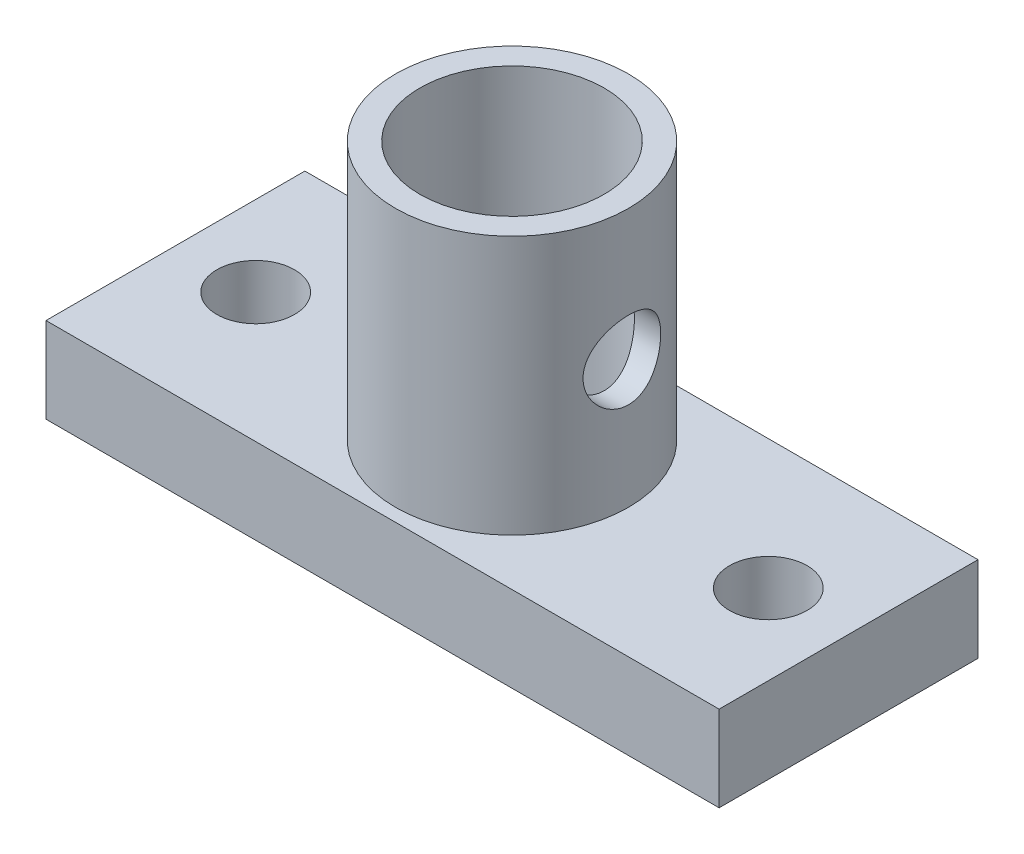
ISO-10303-21;
HEADER;
FILE_DESCRIPTION(('STEP AP214'),'2;1');
FILE_NAME('part.step','',(''),(''),'','','');
FILE_SCHEMA(('AUTOMOTIVE_DESIGN { 1 0 10303 214 1 1 1 1 }'));
ENDSEC;
DATA;
#1=APPLICATION_CONTEXT('core data for automotive mechanical design processes');
#2=APPLICATION_PROTOCOL_DEFINITION('international standard','automotive_design',2000,#1);
#3=PRODUCT_CONTEXT('',#1,'mechanical');
#4=PRODUCT('Part','Part','',(#3));
#5=PRODUCT_RELATED_PRODUCT_CATEGORY('part','',(#4));
#6=PRODUCT_DEFINITION_FORMATION('','',#4);
#7=PRODUCT_DEFINITION_CONTEXT('part definition',#1,'design');
#8=PRODUCT_DEFINITION('design','',#6,#7);
#9=PRODUCT_DEFINITION_SHAPE('','',#8);
#10=(LENGTH_UNIT() NAMED_UNIT(*) SI_UNIT(.MILLI.,.METRE.));
#11=(NAMED_UNIT(*) PLANE_ANGLE_UNIT() SI_UNIT($,.RADIAN.));
#12=(NAMED_UNIT(*) SI_UNIT($,.STERADIAN.) SOLID_ANGLE_UNIT());
#13=UNCERTAINTY_MEASURE_WITH_UNIT(LENGTH_MEASURE(1.E-05),#10,'distance_accuracy_value','');
#14=(GEOMETRIC_REPRESENTATION_CONTEXT(3) GLOBAL_UNCERTAINTY_ASSIGNED_CONTEXT((#13)) GLOBAL_UNIT_ASSIGNED_CONTEXT((#10,
#11,#12)) REPRESENTATION_CONTEXT('',''));
#15=CARTESIAN_POINT('',(0.,0.,0.));
#16=DIRECTION('',(0.,0.,1.));
#17=DIRECTION('',(1.,0.,0.));
#18=AXIS2_PLACEMENT_3D('',#15,#16,#17);
#19=CARTESIAN_POINT('',(0.,13.302,0.));
#20=DIRECTION('',(0.,-1.,0.));
#21=DIRECTION('',(0.,0.,-1.));
#22=AXIS2_PLACEMENT_3D('',#19,#20,#21);
#23=CYLINDRICAL_SURFACE('',#22,4.5);
#24=CARTESIAN_POINT('',(0.,13.302,0.));
#25=DIRECTION('',(0.,1.,0.));
#26=DIRECTION('',(0.,0.,1.));
#27=AXIS2_PLACEMENT_3D('',#24,#25,#26);
#28=CIRCLE('',#27,4.5);
#29=CARTESIAN_POINT('',(0.,13.302,4.5));
#30=VERTEX_POINT('',#29);
#31=EDGE_CURVE('E204',#30,#30,#28,.T.);
#32=ORIENTED_EDGE('',*,*,#31,.F.);
#33=EDGE_LOOP('',(#32));
#34=FACE_BOUND('',#33,.T.);
#35=CARTESIAN_POINT('',(0.,3.302,0.));
#36=DIRECTION('',(0.,-1.,0.));
#37=DIRECTION('',(0.,0.,-1.));
#38=AXIS2_PLACEMENT_3D('',#35,#36,#37);
#39=CIRCLE('',#38,4.5);
#40=CARTESIAN_POINT('',(0.,3.302,-4.5));
#41=VERTEX_POINT('',#40);
#42=EDGE_CURVE('E12',#41,#41,#39,.F.);
#43=ORIENTED_EDGE('',*,*,#42,.T.);
#44=EDGE_LOOP('',(#43));
#45=FACE_BOUND('',#44,.T.);
#46=CARTESIAN_POINT('',(4.24264068711928,8.23272632288013,1.5));
#47=CARTESIAN_POINT('',(4.24264041795651,8.15102406062602,1.50000038692157));
#48=CARTESIAN_POINT('',(4.24502653936286,8.06932412314475,1.49330217552828));
#49=CARTESIAN_POINT('',(4.25426361121882,7.90834469138876,1.46677669753321));
#50=CARTESIAN_POINT('',(4.26111529713283,7.82906559807143,1.4469472682526));
#51=CARTESIAN_POINT('',(4.27842305533187,7.6752859833842,1.39493322852736));
#52=CARTESIAN_POINT('',(4.28887205956983,7.60077642871606,1.36277283210487));
#53=CARTESIAN_POINT('',(4.31218683015487,7.45818625005819,1.28709244266207));
#54=CARTESIAN_POINT('',(4.32505312955418,7.39010704904969,1.24356994329027));
#55=CARTESIAN_POINT('',(4.3523173411121,7.25964637937266,1.14457671966432));
#56=CARTESIAN_POINT('',(4.36675342266966,7.19755317987254,1.08873651206688));
#57=CARTESIAN_POINT('',(4.39520797201504,7.08341612104318,0.967481500821593));
#58=CARTESIAN_POINT('',(4.40922637243442,7.03137387550658,0.902065162578564));
#59=CARTESIAN_POINT('',(4.43570800382698,6.93750797688574,0.761406761947515));
#60=CARTESIAN_POINT('',(4.44812111552408,6.8959863669532,0.685952866836788));
#61=CARTESIAN_POINT('',(4.46954380156474,6.82633894518887,0.528646834481211));
#62=CARTESIAN_POINT('',(4.47855429304502,6.79820952311477,0.446796428530819));
#63=CARTESIAN_POINT('',(4.49188613147861,6.75712254093154,0.282043226150242));
#64=CARTESIAN_POINT('',(4.49635972166341,6.74367115349463,0.199276132279452));
#65=CARTESIAN_POINT('',(4.5006541232737,6.73075188283914,0.032546812236136));
#66=CARTESIAN_POINT('',(4.50047613394335,6.73128039540151,-0.0514151003158394));
#67=CARTESIAN_POINT('',(4.49559059428104,6.74599270472918,-0.214655272790726));
#68=CARTESIAN_POINT('',(4.49106097132703,6.75964011559189,-0.2939880728875));
#69=CARTESIAN_POINT('',(4.47820451009571,6.79931579435081,-0.449165158233241));
#70=CARTESIAN_POINT('',(4.46987741446672,6.82534490134977,-0.525009206668763));
#71=CARTESIAN_POINT('',(4.45013505439938,6.88935829883933,-0.67222871226302));
#72=CARTESIAN_POINT('',(4.43868063786404,6.9274952307003,-0.743532331453497));
#73=CARTESIAN_POINT('',(4.41387589557997,7.01451588105272,-0.878886488290753));
#74=CARTESIAN_POINT('',(4.40052504300777,7.06340258787009,-0.942935001577153));
#75=CARTESIAN_POINT('',(4.37259287776335,7.17323791307124,-1.06515129982786));
#76=CARTESIAN_POINT('',(4.35798322759,7.2346460596483,-1.12290023560133));
#77=CARTESIAN_POINT('',(4.32971002867667,7.36639941146412,-1.22741588939383));
#78=CARTESIAN_POINT('',(4.31604662597175,7.43674599144999,-1.27418091490951));
#79=CARTESIAN_POINT('',(4.29105787703296,7.58570676130326,-1.3559811825641));
#80=CARTESIAN_POINT('',(4.27976864008232,7.66442451993185,-1.39083969547657));
#81=CARTESIAN_POINT('',(4.26122476317448,7.82708341427953,-1.44666478994926));
#82=CARTESIAN_POINT('',(4.25396843251835,7.91102234471287,-1.46763719363329));
#83=CARTESIAN_POINT('',(4.24469454453105,8.07768385598106,-1.49424192313571));
#84=CARTESIAN_POINT('',(4.24245540472709,8.16029045999872,-1.50052364325862));
#85=CARTESIAN_POINT('',(4.24285008094201,8.32539054655569,-1.49940815836741));
#86=CARTESIAN_POINT('',(4.24548301189152,8.40788404691727,-1.49201343784089));
#87=CARTESIAN_POINT('',(4.25510427134068,8.56746177144688,-1.46433847732775));
#88=CARTESIAN_POINT('',(4.2619398816089,8.64463446810609,-1.44450959097083));
#89=CARTESIAN_POINT('',(4.27902830506905,8.79454173223921,-1.39307079384089));
#90=CARTESIAN_POINT('',(4.2892817240236,8.86727551026638,-1.36145879454519));
#91=CARTESIAN_POINT('',(4.31245316393576,9.00879695415055,-1.28621151110835));
#92=CARTESIAN_POINT('',(4.32544538498415,9.07738628684281,-1.24222667753773));
#93=CARTESIAN_POINT('',(4.35248653096476,9.20644540145573,-1.14387844583635));
#94=CARTESIAN_POINT('',(4.36653576665699,9.26691278087197,-1.08951198824818));
#95=CARTESIAN_POINT('',(4.39492557956765,9.38101829901608,-0.968837558850485));
#96=CARTESIAN_POINT('',(4.40924765366843,9.4341879079084,-0.902080905819978));
#97=CARTESIAN_POINT('',(4.43590277419665,9.5286005364022,-0.760240937100387));
#98=CARTESIAN_POINT('',(4.44823589126543,9.56984397962377,-0.68515791729683));
#99=CARTESIAN_POINT('',(4.46946608715904,9.63885648017271,-0.529169793648444));
#100=CARTESIAN_POINT('',(4.47838545006797,9.66671323860223,-0.448306684981795));
#101=CARTESIAN_POINT('',(4.49187916256662,9.70831793597029,-0.282687698769025));
#102=CARTESIAN_POINT('',(4.49645508051028,9.72207096770089,-0.197933237930835));
#103=CARTESIAN_POINT('',(4.50062794854384,9.7346194392886,-0.031223003790062));
#104=CARTESIAN_POINT('',(4.50044880134159,9.7340875037787,0.0506770858800273));
#105=CARTESIAN_POINT('',(4.49568294779097,9.71974036066052,0.21316671750026));
#106=CARTESIAN_POINT('',(4.49109659900364,9.70592623065098,0.293756365228585));
#107=CARTESIAN_POINT('',(4.47811372431618,9.66585297101619,0.450063179148087));
#108=CARTESIAN_POINT('',(4.46977887541723,9.63979499985073,0.525837406369183));
#109=CARTESIAN_POINT('',(4.45015741056742,9.5761600262344,0.671967526409692));
#110=CARTESIAN_POINT('',(4.43887026072025,9.53858094008462,0.742322436213648));
#111=CARTESIAN_POINT('',(4.41398803241821,9.45137205472712,0.878451024463177));
#112=CARTESIAN_POINT('',(4.4003230873789,9.40134829480768,0.943959377336409));
#113=CARTESIAN_POINT('',(4.37239483187819,9.29134023614584,1.06587153940864));
#114=CARTESIAN_POINT('',(4.35813133159646,9.23135275948604,1.12227243243689));
#115=CARTESIAN_POINT('',(4.32994919738397,9.10031228949971,1.22661271324968));
#116=CARTESIAN_POINT('',(4.31606591982946,9.02891805641518,1.27413444899685));
#117=CARTESIAN_POINT('',(4.29090289984523,8.87872468252597,1.35647151495167));
#118=CARTESIAN_POINT('',(4.27962247741874,8.79992748333564,1.39129016522921));
#119=CARTESIAN_POINT('',(4.26152001309772,8.64078358685668,1.44576574230625));
#120=CARTESIAN_POINT('',(4.25451949285773,8.56066792759209,1.46603686372428));
#121=CARTESIAN_POINT('',(4.24508075309277,8.39794224718008,1.4931514802239));
#122=CARTESIAN_POINT('',(4.24264095926192,8.31533309676407,1.49999960879489));
#123=CARTESIAN_POINT('',(4.24264068711928,8.23272632288013,1.5));
#124=B_SPLINE_CURVE_WITH_KNOTS('',3,(#46,#47,#48,#49,#50,#51,#52,#53,#54,#55,#56,#57,#58,#59,
#60,#61,#62,#63,#64,#65,#66,#67,#68,#69,#70,#71,#72,#73,#74,#75,#76,#77,#78,#79,#80,#81,#82,#83,
#84,#85,#86,#87,#88,#89,#90,#91,#92,#93,#94,#95,#96,#97,#98,#99,#100,#101,#102,#103,#104,#105,
#106,#107,#108,#109,#110,#111,#112,#113,#114,#115,#116,#117,#118,#119,#120,#121,#122,#123),
.UNSPECIFIED.,.T.,.F.,(4,2,2,2,2,2,2,2,2,2,2,2,2,2,2,2,2,2,2,2,2,2,2,2,2,2,2,2,2,2,2,2,2,2,2,2,
2,2,4),(0.,0.244800877199033,0.489642082522745,0.734004941251241,0.978421749278163,
1.23152006141352,1.48465897757982,1.74440259215486,2.00407614580184,2.25471478147401,
2.50528879953491,2.74603507238353,2.98679766283855,3.23072482290502,3.47471987811033,
3.73020261545876,3.98572469418159,4.24488959763007,4.50394577031475,4.75131437043211,
4.99863803752402,5.23746593649716,5.4763361871697,5.72278286600124,5.96930228489743,
6.22768212253191,6.4860527813285,6.74270686782829,6.99926824502786,7.24377127013005,
7.48825446011223,7.72885434057196,7.96949776141415,8.21903279277502,8.46864756645499,
8.72803354100768,8.98735167396852,9.23494818240588,9.48245920782247),.UNSPECIFIED.);
#125=CARTESIAN_POINT('',(4.24264068711928,8.23272632288013,1.5));
#126=VERTEX_POINT('',#125);
#127=EDGE_CURVE('E145',#126,#126,#124,.T.);
#128=ORIENTED_EDGE('',*,*,#127,.F.);
#129=EDGE_LOOP('',(#128));
#130=FACE_BOUND('',#129,.T.);
#131=ADVANCED_FACE('F46',(#34,#45,#130),#23,.T.);
#132=CARTESIAN_POINT('',(0.,13.302,0.));
#133=DIRECTION('',(0.,-1.,0.));
#134=DIRECTION('',(0.,0.,-1.));
#135=AXIS2_PLACEMENT_3D('',#132,#133,#134);
#136=CYLINDRICAL_SURFACE('',#135,3.56);
#137=CARTESIAN_POINT('',(0.,13.302,0.));
#138=DIRECTION('',(0.,1.,0.));
#139=DIRECTION('',(0.,0.,1.));
#140=AXIS2_PLACEMENT_3D('',#137,#138,#139);
#141=CIRCLE('',#140,3.56);
#142=CARTESIAN_POINT('',(0.,13.302,3.56));
#143=VERTEX_POINT('',#142);
#144=EDGE_CURVE('E163',#143,#143,#141,.T.);
#145=ORIENTED_EDGE('',*,*,#144,.T.);
#146=EDGE_LOOP('',(#145));
#147=FACE_BOUND('',#146,.T.);
#148=CARTESIAN_POINT('',(3.22856005054885,8.23272632288013,1.5));
#149=CARTESIAN_POINT('',(3.22856903799504,8.15281256452826,1.4999907912553));
#150=CARTESIAN_POINT('',(3.23157047324856,8.07277212674466,1.49357331900394));
#151=CARTESIAN_POINT('',(3.2431937701901,7.91500674092847,1.46815386574932));
#152=CARTESIAN_POINT('',(3.25183073377135,7.83728860302974,1.44911806840881));
#153=CARTESIAN_POINT('',(3.27355691081131,7.68673747727222,1.39934048809461));
#154=CARTESIAN_POINT('',(3.28662767255958,7.61388571763523,1.36864715680999));
#155=CARTESIAN_POINT('',(3.31572245921005,7.47438602176685,1.29656817195082));
#156=CARTESIAN_POINT('',(3.33174583174344,7.40773672001072,1.25518487947499));
#157=CARTESIAN_POINT('',(3.36608084425194,7.2782511510051,1.16008431594066));
#158=CARTESIAN_POINT('',(3.38447118923387,7.2158572743296,1.10579283370672));
#159=CARTESIAN_POINT('',(3.42082185704714,7.10073207895956,0.987622211718407));
#160=CARTESIAN_POINT('',(3.43878200950932,7.0480045351662,0.923739343970878));
#161=CARTESIAN_POINT('',(3.47320900464208,6.95143433344243,0.784707089461344));
#162=CARTESIAN_POINT('',(3.48957373434764,6.90809188420794,0.709182675100814));
#163=CARTESIAN_POINT('',(3.51799982561146,6.83491935862993,0.551100156613585));
#164=CARTESIAN_POINT('',(3.53006313789325,6.80508315544836,0.468545261957337));
#165=CARTESIAN_POINT('',(3.54796857287151,6.76138103265961,0.303392314813243));
#166=CARTESIAN_POINT('',(3.5541068883238,6.74675157655394,0.221029079549135));
#167=CARTESIAN_POINT('',(3.56054815414791,6.73140858768197,0.0548035427512937));
#168=CARTESIAN_POINT('',(3.56085352810225,6.73068927526061,-0.0290581216882796));
#169=CARTESIAN_POINT('',(3.55576718462711,6.74279225507445,-0.190338785392584));
#170=CARTESIAN_POINT('',(3.55072869203961,6.75477493020457,-0.267834037786386));
#171=CARTESIAN_POINT('',(3.53600838684386,6.79049922365205,-0.419594195348377));
#172=CARTESIAN_POINT('',(3.52632623156531,6.81424170976659,-0.493858861680406));
#173=CARTESIAN_POINT('',(3.5030658651684,6.87309046632996,-0.638416786807389));
#174=CARTESIAN_POINT('',(3.4894303693059,6.90836487218847,-0.708631999748616));
#175=CARTESIAN_POINT('',(3.45959217395679,6.98910913168322,-0.842330829755993));
#176=CARTESIAN_POINT('',(3.44338856141603,7.03458261383936,-0.905812039200719));
#177=CARTESIAN_POINT('',(3.40866069256266,7.13823177167855,-1.02908870786263));
#178=CARTESIAN_POINT('',(3.39005334790792,7.1970853614866,-1.08829159826811));
#179=CARTESIAN_POINT('',(3.35348305945775,7.3239179350859,-1.19624702714725));
#180=CARTESIAN_POINT('',(3.33552037809823,7.39190058300257,-1.24499534896627));
#181=CARTESIAN_POINT('',(3.30167199995551,7.53799755150925,-1.33222800914388));
#182=CARTESIAN_POINT('',(3.28587851507421,7.61637914033686,-1.37030360547895));
#183=CARTESIAN_POINT('',(3.25926094156996,7.77928356192843,-1.43247171468837));
#184=CARTESIAN_POINT('',(3.24843320748228,7.86380183664902,-1.45657448875656));
#185=CARTESIAN_POINT('',(3.23388301788111,8.03063760712194,-1.48858720342359));
#186=CARTESIAN_POINT('',(3.22973928016787,8.1127329817022,-1.49745973187005));
#187=CARTESIAN_POINT('',(3.22782094991937,8.27732648098605,-1.50159276385574));
#188=CARTESIAN_POINT('',(3.23004406966687,8.35982445039649,-1.4968581566618));
#189=CARTESIAN_POINT('',(3.24017291544486,8.5171303387944,-1.47479026810248));
#190=CARTESIAN_POINT('',(3.24769318769408,8.5920860544293,-1.45831071163109));
#191=CARTESIAN_POINT('',(3.26707230743927,8.73810322964508,-1.41435887393763));
#192=CARTESIAN_POINT('',(3.27893218431699,8.80916376066123,-1.38688398440774));
#193=CARTESIAN_POINT('',(3.3062718941516,8.94877550191605,-1.32041892098537));
#194=CARTESIAN_POINT('',(3.32188496284042,9.01708905259907,-1.28098612750676));
#195=CARTESIAN_POINT('',(3.35478638327119,9.14646260992017,-1.19216161045677));
#196=CARTESIAN_POINT('',(3.37207546983221,9.2075194086163,-1.14276550830642));
#197=CARTESIAN_POINT('',(3.40812497358031,9.32596106860609,-1.03055068661081));
#198=CARTESIAN_POINT('',(3.42688754811191,9.38261210371034,-0.966955015763755));
#199=CARTESIAN_POINT('',(3.46243241740758,9.48457524593581,-0.830729720782054));
#200=CARTESIAN_POINT('',(3.47921454684392,9.5298864067567,-0.758099343467459));
#201=CARTESIAN_POINT('',(3.50903398419767,9.60787190441726,-0.6052723905076));
#202=CARTESIAN_POINT('',(3.52205817775306,9.64050212174153,-0.52505058515087));
#203=CARTESIAN_POINT('',(3.54277409632925,9.6915609005703,-0.359565129313889));
#204=CARTESIAN_POINT('',(3.55046907443072,9.7099981265845,-0.274304589160597));
#205=CARTESIAN_POINT('',(3.55927770758005,9.73103853859297,-0.107713229260998));
#206=CARTESIAN_POINT('',(3.56082095473764,9.73467566864486,-0.0265348532875108));
#207=CARTESIAN_POINT('',(3.55834901354796,9.72880650280158,0.135249913285485));
#208=CARTESIAN_POINT('',(3.55433483901265,9.71930260415732,0.215856405514796));
#209=CARTESIAN_POINT('',(3.54142747509769,9.68816354175388,0.371140199291935));
#210=CARTESIAN_POINT('',(3.53271971818332,9.66698879137912,0.44592653361634));
#211=CARTESIAN_POINT('',(3.51139053236149,9.61361735301187,0.590852507667779));
#212=CARTESIAN_POINT('',(3.49876836887224,9.5814185961243,0.660991272225936));
#213=CARTESIAN_POINT('',(3.47011553351842,9.50528282946084,0.798141030306139));
#214=CARTESIAN_POINT('',(3.45395615374841,9.46087935580345,0.864865548459535));
#215=CARTESIAN_POINT('',(3.42013437106276,9.36226719314545,0.990203038594991));
#216=CARTESIAN_POINT('',(3.40247139657282,9.30805476649056,1.04881290344803));
#217=CARTESIAN_POINT('',(3.36607893310427,9.18690234634033,1.1605178474167));
#218=CARTESIAN_POINT('',(3.34736111813093,9.11933786541351,1.21294183822222));
#219=CARTESIAN_POINT('',(3.31223874829279,8.97579890390139,1.30581373837377));
#220=CARTESIAN_POINT('',(3.2958355081554,8.89981968695069,1.3462548554236));
#221=CARTESIAN_POINT('',(3.26750563572018,8.7416631911712,1.41362793089258));
#222=CARTESIAN_POINT('',(3.25556113236194,8.65951227619755,1.44061396796833));
#223=CARTESIAN_POINT('',(3.23783135944962,8.49132090297902,1.48004585545366));
#224=CARTESIAN_POINT('',(3.23202543693142,8.40529450886666,1.49254047539742));
#225=CARTESIAN_POINT('',(3.22894086501203,8.29020773863197,1.4991772718107));
#226=CARTESIAN_POINT('',(3.22855681732288,8.26147522814652,1.50000331283792));
#227=CARTESIAN_POINT('',(3.22856005054885,8.23272632288013,1.5));
#228=B_SPLINE_CURVE_WITH_KNOTS('',3,(#148,#149,#150,#151,#152,#153,#154,#155,#156,#157,#158,
#159,#160,#161,#162,#163,#164,#165,#166,#167,#168,#169,#170,#171,#172,#173,#174,#175,#176,#177,
#178,#179,#180,#181,#182,#183,#184,#185,#186,#187,#188,#189,#190,#191,#192,#193,#194,#195,#196,
#197,#198,#199,#200,#201,#202,#203,#204,#205,#206,#207,#208,#209,#210,#211,#212,#213,#214,#215,
#216,#217,#218,#219,#220,#221,#222,#223,#224,#225,#226,#227),.UNSPECIFIED.,.T.,.F.,(4,2,2,2,2,2,
2,2,2,2,2,2,2,2,2,2,2,2,2,2,2,2,2,2,2,2,2,2,2,2,2,2,2,2,2,2,2,2,2,4),(0.,0.239657429273658,
0.479959736514752,0.719274025833467,0.958535502776575,1.21161242274511,1.46478796488216,
1.72923760368429,1.993567159693,2.24386823055415,2.49406529925797,2.72869802346889,
2.96334806462154,3.20158444384972,3.43990571513144,3.69535094348089,3.95089900792195,
4.21519988966611,4.47930643061585,4.72600522789581,4.9726153933388,5.20291966584194,
5.43327860343275,5.67349929225365,5.91382578187224,6.17424579419613,6.43468753104943,
6.69602745313542,6.95720770613359,7.19979139480573,7.44233083600941,7.67592380193825,
7.90956063073006,8.15380229188229,8.39813721689392,8.65953753978267,8.92108575096001,
9.1815740986125,9.44118322929546,9.52739978164727),.UNSPECIFIED.);
#229=CARTESIAN_POINT('',(3.22856005054885,8.23272632288013,1.5));
#230=VERTEX_POINT('',#229);
#231=EDGE_CURVE('E137',#230,#230,#228,.T.);
#232=ORIENTED_EDGE('',*,*,#231,.T.);
#233=EDGE_LOOP('',(#232));
#234=FACE_BOUND('',#233,.T.);
#235=CARTESIAN_POINT('',(0.,0.,0.));
#236=DIRECTION('',(0.,-1.,0.));
#237=DIRECTION('',(0.,0.,-1.));
#238=AXIS2_PLACEMENT_3D('',#235,#236,#237);
#239=CIRCLE('',#238,3.56);
#240=CARTESIAN_POINT('',(0.,0.,-3.56));
#241=VERTEX_POINT('',#240);
#242=EDGE_CURVE('E50',#241,#241,#239,.T.);
#243=ORIENTED_EDGE('',*,*,#242,.T.);
#244=EDGE_LOOP('',(#243));
#245=FACE_BOUND('',#244,.T.);
#246=ADVANCED_FACE('F146',(#147,#234,#245),#136,.F.);
#247=CARTESIAN_POINT('',(0.,3.302,0.));
#248=DIRECTION('',(0.,-1.,0.));
#249=DIRECTION('',(0.,0.,-1.));
#250=AXIS2_PLACEMENT_3D('',#247,#248,#249);
#251=PLANE('',#250);
#252=ORIENTED_EDGE('',*,*,#42,.F.);
#253=EDGE_LOOP('',(#252));
#254=FACE_BOUND('',#253,.T.);
#255=DIRECTION('',(0.,0.,-1.));
#256=VECTOR('',#255,1.);
#257=CARTESIAN_POINT('',(13.,3.302,5.));
#258=LINE('',#257,#256);
#259=CARTESIAN_POINT('',(13.,3.302,5.));
#260=VERTEX_POINT('',#259);
#261=CARTESIAN_POINT('',(13.,3.302,-5.));
#262=VERTEX_POINT('',#261);
#263=EDGE_CURVE('E103',#260,#262,#258,.T.);
#264=ORIENTED_EDGE('',*,*,#263,.T.);
#265=DIRECTION('',(-1.,0.,0.));
#266=VECTOR('',#265,1.);
#267=CARTESIAN_POINT('',(-13.,3.302,-5.));
#268=LINE('',#267,#266);
#269=CARTESIAN_POINT('',(-13.,3.302,-5.));
#270=VERTEX_POINT('',#269);
#271=EDGE_CURVE('E97',#262,#270,#268,.T.);
#272=ORIENTED_EDGE('',*,*,#271,.T.);
#273=DIRECTION('',(0.,0.,1.));
#274=VECTOR('',#273,1.);
#275=CARTESIAN_POINT('',(-13.,3.302,5.));
#276=LINE('',#275,#274);
#277=CARTESIAN_POINT('',(-13.,3.302,5.));
#278=VERTEX_POINT('',#277);
#279=EDGE_CURVE('E101',#270,#278,#276,.T.);
#280=ORIENTED_EDGE('',*,*,#279,.T.);
#281=DIRECTION('',(1.,0.,0.));
#282=VECTOR('',#281,1.);
#283=CARTESIAN_POINT('',(-13.,3.302,5.));
#284=LINE('',#283,#282);
#285=EDGE_CURVE('E66',#278,#260,#284,.T.);
#286=ORIENTED_EDGE('',*,*,#285,.T.);
#287=EDGE_LOOP('',(#264,#272,#280,#286));
#288=FACE_BOUND('',#287,.T.);
#289=CARTESIAN_POINT('',(-9.9,3.302,0.));
#290=DIRECTION('',(0.,1.,0.));
#291=DIRECTION('',(0.,0.,1.));
#292=AXIS2_PLACEMENT_3D('',#289,#290,#291);
#293=CIRCLE('',#292,1.5);
#294=CARTESIAN_POINT('',(-9.9,3.302,-1.5));
#295=VERTEX_POINT('',#294);
#296=EDGE_CURVE('E125',#295,#295,#293,.T.);
#297=ORIENTED_EDGE('',*,*,#296,.F.);
#298=EDGE_LOOP('',(#297));
#299=FACE_BOUND('',#298,.T.);
#300=CARTESIAN_POINT('',(9.9,3.302,0.));
#301=DIRECTION('',(0.,1.,0.));
#302=DIRECTION('',(0.,0.,1.));
#303=AXIS2_PLACEMENT_3D('',#300,#301,#302);
#304=CIRCLE('',#303,1.5);
#305=CARTESIAN_POINT('',(9.9,3.302,-1.5));
#306=VERTEX_POINT('',#305);
#307=EDGE_CURVE('E203',#306,#306,#304,.T.);
#308=ORIENTED_EDGE('',*,*,#307,.F.);
#309=EDGE_LOOP('',(#308));
#310=FACE_BOUND('',#309,.T.);
#311=ADVANCED_FACE('F98',(#254,#288,#299,#310),#251,.F.);
#312=CARTESIAN_POINT('',(0.,0.,0.));
#313=DIRECTION('',(0.,-1.,0.));
#314=DIRECTION('',(0.,0.,-1.));
#315=AXIS2_PLACEMENT_3D('',#312,#313,#314);
#316=PLANE('',#315);
#317=ORIENTED_EDGE('',*,*,#242,.F.);
#318=EDGE_LOOP('',(#317));
#319=FACE_BOUND('',#318,.T.);
#320=CARTESIAN_POINT('',(-9.9,0.,0.));
#321=DIRECTION('',(0.,1.,0.));
#322=DIRECTION('',(0.,0.,1.));
#323=AXIS2_PLACEMENT_3D('',#320,#321,#322);
#324=CIRCLE('',#323,1.5);
#325=CARTESIAN_POINT('',(-9.9,0.,-1.5));
#326=VERTEX_POINT('',#325);
#327=EDGE_CURVE('E209',#326,#326,#324,.T.);
#328=ORIENTED_EDGE('',*,*,#327,.T.);
#329=EDGE_LOOP('',(#328));
#330=FACE_BOUND('',#329,.T.);
#331=DIRECTION('',(0.,0.,-1.));
#332=VECTOR('',#331,1.);
#333=CARTESIAN_POINT('',(13.,0.,5.));
#334=LINE('',#333,#332);
#335=CARTESIAN_POINT('',(13.,0.,5.));
#336=VERTEX_POINT('',#335);
#337=CARTESIAN_POINT('',(13.,0.,-5.));
#338=VERTEX_POINT('',#337);
#339=EDGE_CURVE('E121',#336,#338,#334,.T.);
#340=ORIENTED_EDGE('',*,*,#339,.F.);
#341=DIRECTION('',(1.,0.,0.));
#342=VECTOR('',#341,1.);
#343=CARTESIAN_POINT('',(-13.,0.,5.));
#344=LINE('',#343,#342);
#345=CARTESIAN_POINT('',(-13.,0.,5.));
#346=VERTEX_POINT('',#345);
#347=EDGE_CURVE('E89',#346,#336,#344,.T.);
#348=ORIENTED_EDGE('',*,*,#347,.F.);
#349=DIRECTION('',(0.,0.,1.));
#350=VECTOR('',#349,1.);
#351=CARTESIAN_POINT('',(-13.,0.,5.));
#352=LINE('',#351,#350);
#353=CARTESIAN_POINT('',(-13.,0.,-5.));
#354=VERTEX_POINT('',#353);
#355=EDGE_CURVE('E83',#354,#346,#352,.T.);
#356=ORIENTED_EDGE('',*,*,#355,.F.);
#357=DIRECTION('',(-1.,0.,0.));
#358=VECTOR('',#357,1.);
#359=CARTESIAN_POINT('',(-13.,0.,-5.));
#360=LINE('',#359,#358);
#361=EDGE_CURVE('E109',#338,#354,#360,.T.);
#362=ORIENTED_EDGE('',*,*,#361,.F.);
#363=EDGE_LOOP('',(#340,#348,#356,#362));
#364=FACE_BOUND('',#363,.T.);
#365=CARTESIAN_POINT('',(9.9,0.,0.));
#366=DIRECTION('',(0.,1.,0.));
#367=DIRECTION('',(0.,0.,1.));
#368=AXIS2_PLACEMENT_3D('',#365,#366,#367);
#369=CIRCLE('',#368,1.5);
#370=CARTESIAN_POINT('',(9.9,0.,-1.5));
#371=VERTEX_POINT('',#370);
#372=EDGE_CURVE('E200',#371,#371,#369,.T.);
#373=ORIENTED_EDGE('',*,*,#372,.T.);
#374=EDGE_LOOP('',(#373));
#375=FACE_BOUND('',#374,.T.);
#376=ADVANCED_FACE('F180',(#319,#330,#364,#375),#316,.T.);
#377=CARTESIAN_POINT('',(13.,3.302,5.));
#378=DIRECTION('',(-1.,0.,0.));
#379=DIRECTION('',(0.,0.,1.));
#380=AXIS2_PLACEMENT_3D('',#377,#378,#379);
#381=PLANE('',#380);
#382=ORIENTED_EDGE('',*,*,#339,.T.);
#383=DIRECTION('',(0.,-1.,0.));
#384=VECTOR('',#383,1.);
#385=CARTESIAN_POINT('',(13.,3.302,-5.));
#386=LINE('',#385,#384);
#387=EDGE_CURVE('E57',#262,#338,#386,.T.);
#388=ORIENTED_EDGE('',*,*,#387,.F.);
#389=ORIENTED_EDGE('',*,*,#263,.F.);
#390=DIRECTION('',(0.,-1.,0.));
#391=VECTOR('',#390,1.);
#392=CARTESIAN_POINT('',(13.,3.302,5.));
#393=LINE('',#392,#391);
#394=EDGE_CURVE('E117',#260,#336,#393,.T.);
#395=ORIENTED_EDGE('',*,*,#394,.T.);
#396=EDGE_LOOP('',(#382,#388,#389,#395));
#397=FACE_BOUND('',#396,.T.);
#398=ADVANCED_FACE('F48',(#397),#381,.F.);
#399=CARTESIAN_POINT('',(-13.,3.302,-5.));
#400=DIRECTION('',(0.,0.,1.));
#401=DIRECTION('',(1.,0.,0.));
#402=AXIS2_PLACEMENT_3D('',#399,#400,#401);
#403=PLANE('',#402);
#404=ORIENTED_EDGE('',*,*,#361,.T.);
#405=DIRECTION('',(0.,-1.,0.));
#406=VECTOR('',#405,1.);
#407=CARTESIAN_POINT('',(-13.,3.302,-5.));
#408=LINE('',#407,#406);
#409=EDGE_CURVE('E107',#270,#354,#408,.T.);
#410=ORIENTED_EDGE('',*,*,#409,.F.);
#411=ORIENTED_EDGE('',*,*,#271,.F.);
#412=ORIENTED_EDGE('',*,*,#387,.T.);
#413=EDGE_LOOP('',(#404,#410,#411,#412));
#414=FACE_BOUND('',#413,.T.);
#415=ADVANCED_FACE('F108',(#414),#403,.F.);
#416=CARTESIAN_POINT('',(-13.,3.302,5.));
#417=DIRECTION('',(1.,0.,0.));
#418=DIRECTION('',(0.,0.,-1.));
#419=AXIS2_PLACEMENT_3D('',#416,#417,#418);
#420=PLANE('',#419);
#421=ORIENTED_EDGE('',*,*,#355,.T.);
#422=DIRECTION('',(0.,-1.,0.));
#423=VECTOR('',#422,1.);
#424=CARTESIAN_POINT('',(-13.,3.302,5.));
#425=LINE('',#424,#423);
#426=EDGE_CURVE('E111',#278,#346,#425,.T.);
#427=ORIENTED_EDGE('',*,*,#426,.F.);
#428=ORIENTED_EDGE('',*,*,#279,.F.);
#429=ORIENTED_EDGE('',*,*,#409,.T.);
#430=EDGE_LOOP('',(#421,#427,#428,#429));
#431=FACE_BOUND('',#430,.T.);
#432=ADVANCED_FACE('F113',(#431),#420,.F.);
#433=CARTESIAN_POINT('',(-13.,3.302,5.));
#434=DIRECTION('',(0.,0.,-1.));
#435=DIRECTION('',(-1.,0.,0.));
#436=AXIS2_PLACEMENT_3D('',#433,#434,#435);
#437=PLANE('',#436);
#438=ORIENTED_EDGE('',*,*,#347,.T.);
#439=ORIENTED_EDGE('',*,*,#394,.F.);
#440=ORIENTED_EDGE('',*,*,#285,.F.);
#441=ORIENTED_EDGE('',*,*,#426,.T.);
#442=EDGE_LOOP('',(#438,#439,#440,#441));
#443=FACE_BOUND('',#442,.T.);
#444=ADVANCED_FACE('F176',(#443),#437,.F.);
#445=CARTESIAN_POINT('',(-9.9,3.302,0.));
#446=DIRECTION('',(0.,-1.,0.));
#447=DIRECTION('',(0.,0.,-1.));
#448=AXIS2_PLACEMENT_3D('',#445,#446,#447);
#449=CYLINDRICAL_SURFACE('',#448,1.5);
#450=CARTESIAN_POINT('',(-9.9,3.302,-1.5));
#451=CARTESIAN_POINT('',(-9.9,3.26760416666667,-1.5));
#452=CARTESIAN_POINT('',(-9.9,3.23320833333333,-1.5));
#453=CARTESIAN_POINT('',(-9.9,3.16441666666667,-1.5));
#454=CARTESIAN_POINT('',(-9.9,3.13002083333333,-1.5));
#455=CARTESIAN_POINT('',(-9.9,3.06122916666667,-1.5));
#456=CARTESIAN_POINT('',(-9.9,3.02683333333333,-1.5));
#457=CARTESIAN_POINT('',(-9.9,2.95804166666667,-1.5));
#458=CARTESIAN_POINT('',(-9.9,2.92364583333333,-1.5));
#459=CARTESIAN_POINT('',(-9.9,2.85485416666667,-1.5));
#460=CARTESIAN_POINT('',(-9.9,2.82045833333333,-1.5));
#461=CARTESIAN_POINT('',(-9.9,2.75166666666667,-1.5));
#462=CARTESIAN_POINT('',(-9.9,2.71727083333333,-1.5));
#463=CARTESIAN_POINT('',(-9.9,2.64847916666667,-1.5));
#464=CARTESIAN_POINT('',(-9.9,2.61408333333333,-1.5));
#465=CARTESIAN_POINT('',(-9.9,2.54529166666667,-1.5));
#466=CARTESIAN_POINT('',(-9.9,2.51089583333333,-1.5));
#467=CARTESIAN_POINT('',(-9.9,2.44210416666667,-1.5));
#468=CARTESIAN_POINT('',(-9.9,2.40770833333333,-1.5));
#469=CARTESIAN_POINT('',(-9.9,2.33891666666667,-1.5));
#470=CARTESIAN_POINT('',(-9.9,2.30452083333333,-1.5));
#471=CARTESIAN_POINT('',(-9.9,2.23572916666667,-1.5));
#472=CARTESIAN_POINT('',(-9.9,2.20133333333333,-1.5));
#473=CARTESIAN_POINT('',(-9.9,2.13254166666667,-1.5));
#474=CARTESIAN_POINT('',(-9.9,2.09814583333333,-1.5));
#475=CARTESIAN_POINT('',(-9.9,2.02935416666667,-1.5));
#476=CARTESIAN_POINT('',(-9.9,1.99495833333333,-1.5));
#477=CARTESIAN_POINT('',(-9.9,1.92616666666667,-1.5));
#478=CARTESIAN_POINT('',(-9.9,1.89177083333333,-1.5));
#479=CARTESIAN_POINT('',(-9.9,1.82297916666667,-1.5));
#480=CARTESIAN_POINT('',(-9.9,1.78858333333333,-1.5));
#481=CARTESIAN_POINT('',(-9.9,1.71979166666667,-1.5));
#482=CARTESIAN_POINT('',(-9.9,1.68539583333333,-1.5));
#483=CARTESIAN_POINT('',(-9.9,1.61660416666667,-1.5));
#484=CARTESIAN_POINT('',(-9.9,1.58220833333333,-1.5));
#485=CARTESIAN_POINT('',(-9.9,1.51341666666667,-1.5));
#486=CARTESIAN_POINT('',(-9.9,1.47902083333333,-1.5));
#487=CARTESIAN_POINT('',(-9.9,1.41022916666667,-1.5));
#488=CARTESIAN_POINT('',(-9.9,1.37583333333333,-1.5));
#489=CARTESIAN_POINT('',(-9.9,1.30704166666667,-1.5));
#490=CARTESIAN_POINT('',(-9.9,1.27264583333333,-1.5));
#491=CARTESIAN_POINT('',(-9.9,1.20385416666667,-1.5));
#492=CARTESIAN_POINT('',(-9.9,1.16945833333333,-1.5));
#493=CARTESIAN_POINT('',(-9.9,1.10066666666667,-1.5));
#494=CARTESIAN_POINT('',(-9.9,1.06627083333333,-1.5));
#495=CARTESIAN_POINT('',(-9.9,0.997479166666666,-1.5));
#496=CARTESIAN_POINT('',(-9.9,0.963083333333333,-1.5));
#497=CARTESIAN_POINT('',(-9.9,0.894291666666666,-1.5));
#498=CARTESIAN_POINT('',(-9.9,0.859895833333333,-1.5));
#499=CARTESIAN_POINT('',(-9.9,0.791104166666666,-1.5));
#500=CARTESIAN_POINT('',(-9.9,0.756708333333333,-1.5));
#501=CARTESIAN_POINT('',(-9.9,0.687916666666667,-1.5));
#502=CARTESIAN_POINT('',(-9.9,0.653520833333333,-1.5));
#503=CARTESIAN_POINT('',(-9.9,0.584729166666667,-1.5));
#504=CARTESIAN_POINT('',(-9.9,0.550333333333333,-1.5));
#505=CARTESIAN_POINT('',(-9.9,0.481541666666667,-1.5));
#506=CARTESIAN_POINT('',(-9.9,0.447145833333333,-1.5));
#507=CARTESIAN_POINT('',(-9.9,0.378354166666667,-1.5));
#508=CARTESIAN_POINT('',(-9.9,0.343958333333333,-1.5));
#509=CARTESIAN_POINT('',(-9.9,0.275166666666667,-1.5));
#510=CARTESIAN_POINT('',(-9.9,0.240770833333333,-1.5));
#511=CARTESIAN_POINT('',(-9.9,0.171979166666667,-1.5));
#512=CARTESIAN_POINT('',(-9.9,0.137583333333333,-1.5));
#513=CARTESIAN_POINT('',(-9.9,0.0687916666666666,-1.5));
#514=CARTESIAN_POINT('',(-9.9,0.0343958333333333,-1.5));
#515=CARTESIAN_POINT('',(-9.9,0.,-1.5));
#516=B_SPLINE_CURVE_WITH_KNOTS('',3,(#450,#451,#452,#453,#454,#455,#456,#457,#458,#459,#460,
#461,#462,#463,#464,#465,#466,#467,#468,#469,#470,#471,#472,#473,#474,#475,#476,#477,#478,#479,
#480,#481,#482,#483,#484,#485,#486,#487,#488,#489,#490,#491,#492,#493,#494,#495,#496,#497,#498,
#499,#500,#501,#502,#503,#504,#505,#506,#507,#508,#509,#510,#511,#512,#513,#514,#515),
.UNSPECIFIED.,.F.,.F.,(4,2,2,2,2,2,2,2,2,2,2,2,2,2,2,2,2,2,2,2,2,2,2,2,2,2,2,2,2,2,2,2,4),(0.,
0.1031875,0.206375,0.3095625,0.41275,0.5159375,0.619125,0.7223125,0.8255,0.9286875,1.031875,
1.1350625,1.23825,1.3414375,1.444625,1.5478125,1.651,1.7541875,1.857375,1.9605625,2.06375,
2.1669375,2.270125,2.3733125,2.4765,2.5796875,2.682875,2.7860625,2.88925,2.9924375,3.095625,
3.1988125,3.302),.UNSPECIFIED.);
#517=EDGE_CURVE('BSEAM172',#295,#326,#516,.T.);
#518=ORIENTED_EDGE('',*,*,#296,.T.);
#519=ORIENTED_EDGE('',*,*,#327,.F.);
#520=ORIENTED_EDGE('',*,*,#517,.T.);
#521=ORIENTED_EDGE('',*,*,#517,.F.);
#522=EDGE_LOOP('',(#518,#520,#519,#521));
#523=FACE_BOUND('',#522,.T.);
#524=ADVANCED_FACE('F172',(#523),#449,.F.);
#525=CARTESIAN_POINT('',(9.9,3.302,0.));
#526=DIRECTION('',(0.,-1.,0.));
#527=DIRECTION('',(0.,0.,-1.));
#528=AXIS2_PLACEMENT_3D('',#525,#526,#527);
#529=CYLINDRICAL_SURFACE('',#528,1.5);
#530=CARTESIAN_POINT('',(9.9,3.302,-1.5));
#531=CARTESIAN_POINT('',(9.9,3.26760416666667,-1.5));
#532=CARTESIAN_POINT('',(9.9,3.23320833333333,-1.5));
#533=CARTESIAN_POINT('',(9.9,3.16441666666667,-1.5));
#534=CARTESIAN_POINT('',(9.9,3.13002083333333,-1.5));
#535=CARTESIAN_POINT('',(9.9,3.06122916666667,-1.5));
#536=CARTESIAN_POINT('',(9.9,3.02683333333333,-1.5));
#537=CARTESIAN_POINT('',(9.9,2.95804166666667,-1.5));
#538=CARTESIAN_POINT('',(9.9,2.92364583333333,-1.5));
#539=CARTESIAN_POINT('',(9.9,2.85485416666667,-1.5));
#540=CARTESIAN_POINT('',(9.9,2.82045833333333,-1.5));
#541=CARTESIAN_POINT('',(9.9,2.75166666666667,-1.5));
#542=CARTESIAN_POINT('',(9.9,2.71727083333333,-1.5));
#543=CARTESIAN_POINT('',(9.9,2.64847916666667,-1.5));
#544=CARTESIAN_POINT('',(9.9,2.61408333333333,-1.5));
#545=CARTESIAN_POINT('',(9.9,2.54529166666667,-1.5));
#546=CARTESIAN_POINT('',(9.9,2.51089583333333,-1.5));
#547=CARTESIAN_POINT('',(9.9,2.44210416666667,-1.5));
#548=CARTESIAN_POINT('',(9.9,2.40770833333333,-1.5));
#549=CARTESIAN_POINT('',(9.9,2.33891666666667,-1.5));
#550=CARTESIAN_POINT('',(9.9,2.30452083333333,-1.5));
#551=CARTESIAN_POINT('',(9.9,2.23572916666667,-1.5));
#552=CARTESIAN_POINT('',(9.9,2.20133333333333,-1.5));
#553=CARTESIAN_POINT('',(9.9,2.13254166666667,-1.5));
#554=CARTESIAN_POINT('',(9.9,2.09814583333333,-1.5));
#555=CARTESIAN_POINT('',(9.9,2.02935416666667,-1.5));
#556=CARTESIAN_POINT('',(9.9,1.99495833333333,-1.5));
#557=CARTESIAN_POINT('',(9.9,1.92616666666667,-1.5));
#558=CARTESIAN_POINT('',(9.9,1.89177083333333,-1.5));
#559=CARTESIAN_POINT('',(9.9,1.82297916666667,-1.5));
#560=CARTESIAN_POINT('',(9.9,1.78858333333333,-1.5));
#561=CARTESIAN_POINT('',(9.9,1.71979166666667,-1.5));
#562=CARTESIAN_POINT('',(9.9,1.68539583333333,-1.5));
#563=CARTESIAN_POINT('',(9.9,1.61660416666667,-1.5));
#564=CARTESIAN_POINT('',(9.9,1.58220833333333,-1.5));
#565=CARTESIAN_POINT('',(9.9,1.51341666666667,-1.5));
#566=CARTESIAN_POINT('',(9.9,1.47902083333333,-1.5));
#567=CARTESIAN_POINT('',(9.9,1.41022916666667,-1.5));
#568=CARTESIAN_POINT('',(9.9,1.37583333333333,-1.5));
#569=CARTESIAN_POINT('',(9.9,1.30704166666667,-1.5));
#570=CARTESIAN_POINT('',(9.9,1.27264583333333,-1.5));
#571=CARTESIAN_POINT('',(9.9,1.20385416666667,-1.5));
#572=CARTESIAN_POINT('',(9.9,1.16945833333333,-1.5));
#573=CARTESIAN_POINT('',(9.9,1.10066666666667,-1.5));
#574=CARTESIAN_POINT('',(9.9,1.06627083333333,-1.5));
#575=CARTESIAN_POINT('',(9.9,0.997479166666666,-1.5));
#576=CARTESIAN_POINT('',(9.9,0.963083333333333,-1.5));
#577=CARTESIAN_POINT('',(9.9,0.894291666666666,-1.5));
#578=CARTESIAN_POINT('',(9.9,0.859895833333333,-1.5));
#579=CARTESIAN_POINT('',(9.9,0.791104166666666,-1.5));
#580=CARTESIAN_POINT('',(9.9,0.756708333333333,-1.5));
#581=CARTESIAN_POINT('',(9.9,0.687916666666667,-1.5));
#582=CARTESIAN_POINT('',(9.9,0.653520833333333,-1.5));
#583=CARTESIAN_POINT('',(9.9,0.584729166666667,-1.5));
#584=CARTESIAN_POINT('',(9.9,0.550333333333333,-1.5));
#585=CARTESIAN_POINT('',(9.9,0.481541666666667,-1.5));
#586=CARTESIAN_POINT('',(9.9,0.447145833333333,-1.5));
#587=CARTESIAN_POINT('',(9.9,0.378354166666667,-1.5));
#588=CARTESIAN_POINT('',(9.9,0.343958333333333,-1.5));
#589=CARTESIAN_POINT('',(9.9,0.275166666666667,-1.5));
#590=CARTESIAN_POINT('',(9.9,0.240770833333333,-1.5));
#591=CARTESIAN_POINT('',(9.9,0.171979166666667,-1.5));
#592=CARTESIAN_POINT('',(9.9,0.137583333333333,-1.5));
#593=CARTESIAN_POINT('',(9.9,0.0687916666666666,-1.5));
#594=CARTESIAN_POINT('',(9.9,0.0343958333333333,-1.5));
#595=CARTESIAN_POINT('',(9.9,0.,-1.5));
#596=B_SPLINE_CURVE_WITH_KNOTS('',3,(#530,#531,#532,#533,#534,#535,#536,#537,#538,#539,#540,
#541,#542,#543,#544,#545,#546,#547,#548,#549,#550,#551,#552,#553,#554,#555,#556,#557,#558,#559,
#560,#561,#562,#563,#564,#565,#566,#567,#568,#569,#570,#571,#572,#573,#574,#575,#576,#577,#578,
#579,#580,#581,#582,#583,#584,#585,#586,#587,#588,#589,#590,#591,#592,#593,#594,#595),
.UNSPECIFIED.,.F.,.F.,(4,2,2,2,2,2,2,2,2,2,2,2,2,2,2,2,2,2,2,2,2,2,2,2,2,2,2,2,2,2,2,2,4),(0.,
0.1031875,0.206375,0.3095625,0.41275,0.5159375,0.619125,0.7223125,0.8255,0.9286875,1.031875,
1.1350625,1.23825,1.3414375,1.444625,1.5478125,1.651,1.7541875,1.857375,1.9605625,2.06375,
2.1669375,2.270125,2.3733125,2.4765,2.5796875,2.682875,2.7860625,2.88925,2.9924375,3.095625,
3.1988125,3.302),.UNSPECIFIED.);
#597=EDGE_CURVE('BSEAM169',#306,#371,#596,.T.);
#598=ORIENTED_EDGE('',*,*,#307,.T.);
#599=ORIENTED_EDGE('',*,*,#372,.F.);
#600=ORIENTED_EDGE('',*,*,#597,.T.);
#601=ORIENTED_EDGE('',*,*,#597,.F.);
#602=EDGE_LOOP('',(#598,#600,#599,#601));
#603=FACE_BOUND('',#602,.T.);
#604=ADVANCED_FACE('F169',(#603),#529,.F.);
#605=CARTESIAN_POINT('',(0.,13.302,0.));
#606=DIRECTION('',(0.,1.,0.));
#607=DIRECTION('',(0.,0.,1.));
#608=AXIS2_PLACEMENT_3D('',#605,#606,#607);
#609=PLANE('',#608);
#610=ORIENTED_EDGE('',*,*,#31,.T.);
#611=EDGE_LOOP('',(#610));
#612=FACE_BOUND('',#611,.T.);
#613=ORIENTED_EDGE('',*,*,#144,.F.);
#614=EDGE_LOOP('',(#613));
#615=FACE_BOUND('',#614,.T.);
#616=ADVANCED_FACE('F152',(#612,#615),#609,.T.);
#617=CARTESIAN_POINT('',(10.,8.23272632288013,0.));
#618=DIRECTION('',(-1.,0.,0.));
#619=DIRECTION('',(0.,0.,1.));
#620=AXIS2_PLACEMENT_3D('',#617,#618,#619);
#621=CYLINDRICAL_SURFACE('',#620,1.5);
#622=ORIENTED_EDGE('',*,*,#231,.F.);
#623=EDGE_LOOP('',(#622));
#624=FACE_BOUND('',#623,.T.);
#625=ORIENTED_EDGE('',*,*,#127,.T.);
#626=EDGE_LOOP('',(#625));
#627=FACE_BOUND('',#626,.T.);
#628=ADVANCED_FACE('F149',(#624,#627),#621,.F.);
#629=CLOSED_SHELL('',(#131,#246,#311,#376,#398,#415,#432,#444,#524,#604,#616,#628));
#630=MANIFOLD_SOLID_BREP('B2',#629);
#631=ADVANCED_BREP_SHAPE_REPRESENTATION('',(#18,#630),#14);
#632=SHAPE_DEFINITION_REPRESENTATION(#9,#631);
ENDSEC;
END-ISO-10303-21;
